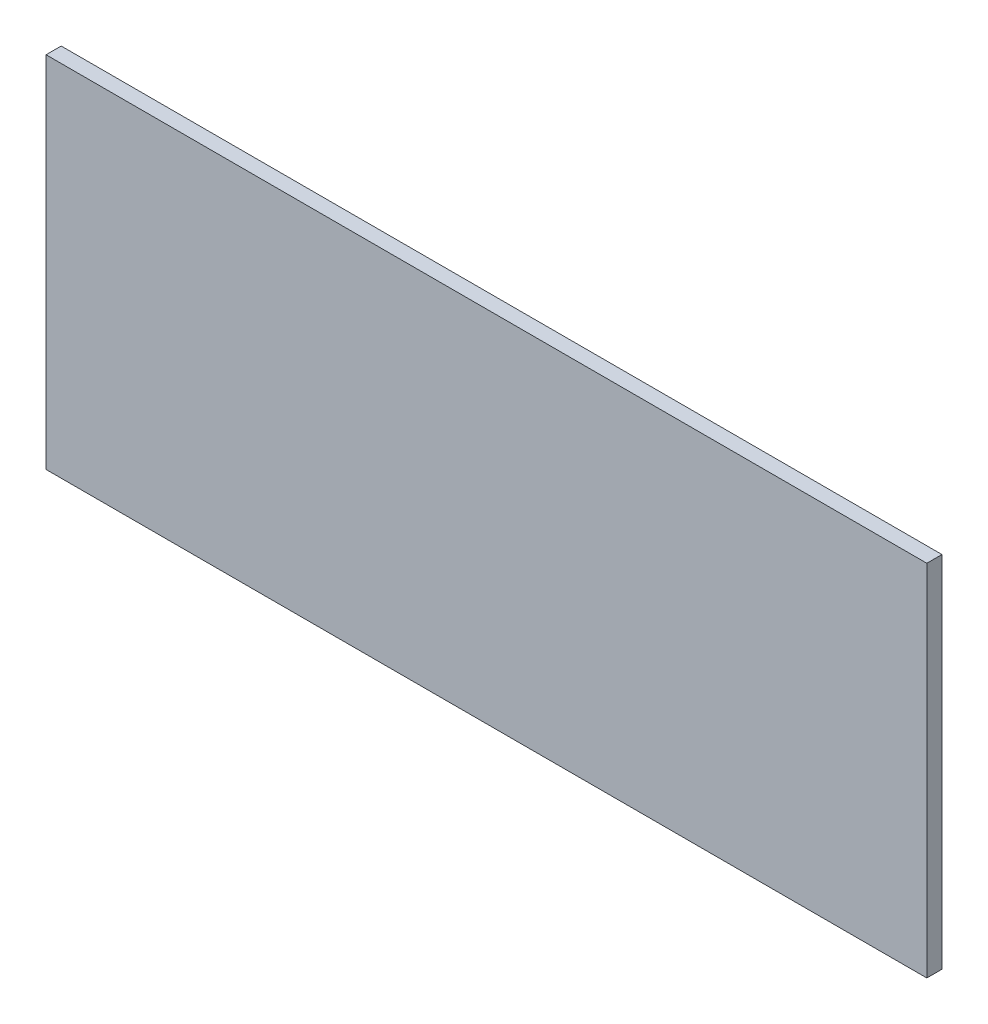
ISO-10303-21;
HEADER;
FILE_DESCRIPTION(('STEP AP214'),'2;1');
FILE_NAME('part.step','',(''),(''),'','','');
FILE_SCHEMA(('AUTOMOTIVE_DESIGN { 1 0 10303 214 1 1 1 1 }'));
ENDSEC;
DATA;
#1=APPLICATION_CONTEXT('core data for automotive mechanical design processes');
#2=APPLICATION_PROTOCOL_DEFINITION('international standard','automotive_design',2000,#1);
#3=PRODUCT_CONTEXT('',#1,'mechanical');
#4=PRODUCT('Part','Part','',(#3));
#5=PRODUCT_RELATED_PRODUCT_CATEGORY('part','',(#4));
#6=PRODUCT_DEFINITION_FORMATION('','',#4);
#7=PRODUCT_DEFINITION_CONTEXT('part definition',#1,'design');
#8=PRODUCT_DEFINITION('design','',#6,#7);
#9=PRODUCT_DEFINITION_SHAPE('','',#8);
#10=(LENGTH_UNIT() NAMED_UNIT(*) SI_UNIT(.MILLI.,.METRE.));
#11=(NAMED_UNIT(*) PLANE_ANGLE_UNIT() SI_UNIT($,.RADIAN.));
#12=(NAMED_UNIT(*) SI_UNIT($,.STERADIAN.) SOLID_ANGLE_UNIT());
#13=UNCERTAINTY_MEASURE_WITH_UNIT(LENGTH_MEASURE(1.E-05),#10,'distance_accuracy_value','');
#14=(GEOMETRIC_REPRESENTATION_CONTEXT(3) GLOBAL_UNCERTAINTY_ASSIGNED_CONTEXT((#13)) GLOBAL_UNIT_ASSIGNED_CONTEXT((#10,
#11,#12)) REPRESENTATION_CONTEXT('',''));
#15=CARTESIAN_POINT('',(0.,0.,0.));
#16=DIRECTION('',(0.,0.,1.));
#17=DIRECTION('',(1.,0.,0.));
#18=AXIS2_PLACEMENT_3D('',#15,#16,#17);
#19=CARTESIAN_POINT('',(-81.9113705984466,39.4593076049943,5.5));
#20=DIRECTION('',(1.,0.,0.));
#21=DIRECTION('',(0.,1.,0.));
#22=AXIS2_PLACEMENT_3D('',#19,#20,#21);
#23=PLANE('',#22);
#24=DIRECTION('',(0.,-1.,0.));
#25=VECTOR('',#24,1.);
#26=CARTESIAN_POINT('',(-81.9113705984466,39.4593076049943,0.));
#27=LINE('',#26,#25);
#28=CARTESIAN_POINT('',(-81.9113705984466,39.4593076049943,0.));
#29=VERTEX_POINT('',#28);
#30=CARTESIAN_POINT('',(-81.9113705984466,-91.0406923950057,0.));
#31=VERTEX_POINT('',#30);
#32=EDGE_CURVE('E96',#29,#31,#27,.T.);
#33=ORIENTED_EDGE('',*,*,#32,.T.);
#34=DIRECTION('',(0.,0.,-1.));
#35=VECTOR('',#34,1.);
#36=CARTESIAN_POINT('',(-81.9113705984466,-91.0406923950057,5.5));
#37=LINE('',#36,#35);
#38=CARTESIAN_POINT('',(-81.9113705984466,-91.0406923950057,5.5));
#39=VERTEX_POINT('',#38);
#40=EDGE_CURVE('E11',#39,#31,#37,.T.);
#41=ORIENTED_EDGE('',*,*,#40,.F.);
#42=DIRECTION('',(0.,-1.,0.));
#43=VECTOR('',#42,1.);
#44=CARTESIAN_POINT('',(-81.9113705984466,39.4593076049943,5.5));
#45=LINE('',#44,#43);
#46=CARTESIAN_POINT('',(-81.9113705984466,39.4593076049943,5.5));
#47=VERTEX_POINT('',#46);
#48=EDGE_CURVE('E84',#47,#39,#45,.T.);
#49=ORIENTED_EDGE('',*,*,#48,.F.);
#50=DIRECTION('',(0.,0.,-1.));
#51=VECTOR('',#50,1.);
#52=CARTESIAN_POINT('',(-81.9113705984466,39.4593076049943,5.5));
#53=LINE('',#52,#51);
#54=EDGE_CURVE('E92',#47,#29,#53,.T.);
#55=ORIENTED_EDGE('',*,*,#54,.T.);
#56=EDGE_LOOP('',(#33,#41,#49,#55));
#57=FACE_BOUND('',#56,.T.);
#58=ADVANCED_FACE('F33',(#57),#23,.F.);
#59=CARTESIAN_POINT('',(-81.9113705984466,-91.0406923950057,5.5));
#60=DIRECTION('',(0.,1.,0.));
#61=DIRECTION('',(0.,0.,1.));
#62=AXIS2_PLACEMENT_3D('',#59,#60,#61);
#63=PLANE('',#62);
#64=DIRECTION('',(1.,0.,0.));
#65=VECTOR('',#64,1.);
#66=CARTESIAN_POINT('',(-81.9113705984466,-91.0406923950057,0.));
#67=LINE('',#66,#65);
#68=CARTESIAN_POINT('',(238.088629401553,-91.0406923950057,0.));
#69=VERTEX_POINT('',#68);
#70=EDGE_CURVE('E88',#31,#69,#67,.T.);
#71=ORIENTED_EDGE('',*,*,#70,.T.);
#72=DIRECTION('',(0.,0.,-1.));
#73=VECTOR('',#72,1.);
#74=CARTESIAN_POINT('',(238.088629401553,-91.0406923950057,5.5));
#75=LINE('',#74,#73);
#76=CARTESIAN_POINT('',(238.088629401553,-91.0406923950057,5.5));
#77=VERTEX_POINT('',#76);
#78=EDGE_CURVE('E41',#77,#69,#75,.T.);
#79=ORIENTED_EDGE('',*,*,#78,.F.);
#80=DIRECTION('',(1.,0.,0.));
#81=VECTOR('',#80,1.);
#82=CARTESIAN_POINT('',(-81.9113705984466,-91.0406923950057,5.5));
#83=LINE('',#82,#81);
#84=EDGE_CURVE('E79',#39,#77,#83,.T.);
#85=ORIENTED_EDGE('',*,*,#84,.F.);
#86=ORIENTED_EDGE('',*,*,#40,.T.);
#87=EDGE_LOOP('',(#71,#79,#85,#86));
#88=FACE_BOUND('',#87,.T.);
#89=ADVANCED_FACE('F87',(#88),#63,.F.);
#90=CARTESIAN_POINT('',(238.088629401553,39.4593076049943,5.5));
#91=DIRECTION('',(-1.,0.,0.));
#92=DIRECTION('',(0.,0.,1.));
#93=AXIS2_PLACEMENT_3D('',#90,#91,#92);
#94=PLANE('',#93);
#95=DIRECTION('',(0.,1.,0.));
#96=VECTOR('',#95,1.);
#97=CARTESIAN_POINT('',(238.088629401553,39.4593076049943,0.));
#98=LINE('',#97,#96);
#99=CARTESIAN_POINT('',(238.088629401553,39.4593076049943,0.));
#100=VERTEX_POINT('',#99);
#101=EDGE_CURVE('E66',#69,#100,#98,.T.);
#102=ORIENTED_EDGE('',*,*,#101,.T.);
#103=DIRECTION('',(0.,0.,-1.));
#104=VECTOR('',#103,1.);
#105=CARTESIAN_POINT('',(238.088629401553,39.4593076049943,5.5));
#106=LINE('',#105,#104);
#107=CARTESIAN_POINT('',(238.088629401553,39.4593076049943,5.5));
#108=VERTEX_POINT('',#107);
#109=EDGE_CURVE('E89',#108,#100,#106,.T.);
#110=ORIENTED_EDGE('',*,*,#109,.F.);
#111=DIRECTION('',(0.,1.,0.));
#112=VECTOR('',#111,1.);
#113=CARTESIAN_POINT('',(238.088629401553,39.4593076049943,5.5));
#114=LINE('',#113,#112);
#115=EDGE_CURVE('E82',#77,#108,#114,.T.);
#116=ORIENTED_EDGE('',*,*,#115,.F.);
#117=ORIENTED_EDGE('',*,*,#78,.T.);
#118=EDGE_LOOP('',(#102,#110,#116,#117));
#119=FACE_BOUND('',#118,.T.);
#120=ADVANCED_FACE('F90',(#119),#94,.F.);
#121=CARTESIAN_POINT('',(-81.9113705984466,39.4593076049943,5.5));
#122=DIRECTION('',(0.,-1.,0.));
#123=DIRECTION('',(0.,0.,-1.));
#124=AXIS2_PLACEMENT_3D('',#121,#122,#123);
#125=PLANE('',#124);
#126=DIRECTION('',(-1.,0.,0.));
#127=VECTOR('',#126,1.);
#128=CARTESIAN_POINT('',(-81.9113705984466,39.4593076049943,0.));
#129=LINE('',#128,#127);
#130=EDGE_CURVE('E72',#100,#29,#129,.T.);
#131=ORIENTED_EDGE('',*,*,#130,.T.);
#132=ORIENTED_EDGE('',*,*,#54,.F.);
#133=DIRECTION('',(-1.,0.,0.));
#134=VECTOR('',#133,1.);
#135=CARTESIAN_POINT('',(-81.9113705984466,39.4593076049943,5.5));
#136=LINE('',#135,#134);
#137=EDGE_CURVE('E49',#108,#47,#136,.T.);
#138=ORIENTED_EDGE('',*,*,#137,.F.);
#139=ORIENTED_EDGE('',*,*,#109,.T.);
#140=EDGE_LOOP('',(#131,#132,#138,#139));
#141=FACE_BOUND('',#140,.T.);
#142=ADVANCED_FACE('F103',(#141),#125,.F.);
#143=CARTESIAN_POINT('',(0.,0.,5.5));
#144=DIRECTION('',(0.,0.,1.));
#145=DIRECTION('',(1.,0.,0.));
#146=AXIS2_PLACEMENT_3D('',#143,#144,#145);
#147=PLANE('',#146);
#148=ORIENTED_EDGE('',*,*,#48,.T.);
#149=ORIENTED_EDGE('',*,*,#84,.T.);
#150=ORIENTED_EDGE('',*,*,#115,.T.);
#151=ORIENTED_EDGE('',*,*,#137,.T.);
#152=EDGE_LOOP('',(#148,#149,#150,#151));
#153=FACE_BOUND('',#152,.T.);
#154=ADVANCED_FACE('F80',(#153),#147,.T.);
#155=CARTESIAN_POINT('',(0.,0.,0.));
#156=DIRECTION('',(0.,0.,1.));
#157=DIRECTION('',(1.,0.,0.));
#158=AXIS2_PLACEMENT_3D('',#155,#156,#157);
#159=PLANE('',#158);
#160=ORIENTED_EDGE('',*,*,#32,.F.);
#161=ORIENTED_EDGE('',*,*,#130,.F.);
#162=ORIENTED_EDGE('',*,*,#101,.F.);
#163=ORIENTED_EDGE('',*,*,#70,.F.);
#164=EDGE_LOOP('',(#160,#161,#162,#163));
#165=FACE_BOUND('',#164,.T.);
#166=ADVANCED_FACE('F106',(#165),#159,.F.);
#167=CLOSED_SHELL('',(#58,#89,#120,#142,#154,#166));
#168=MANIFOLD_SOLID_BREP('B2',#167);
#169=ADVANCED_BREP_SHAPE_REPRESENTATION('',(#18,#168),#14);
#170=SHAPE_DEFINITION_REPRESENTATION(#9,#169);
ENDSEC;
END-ISO-10303-21;
